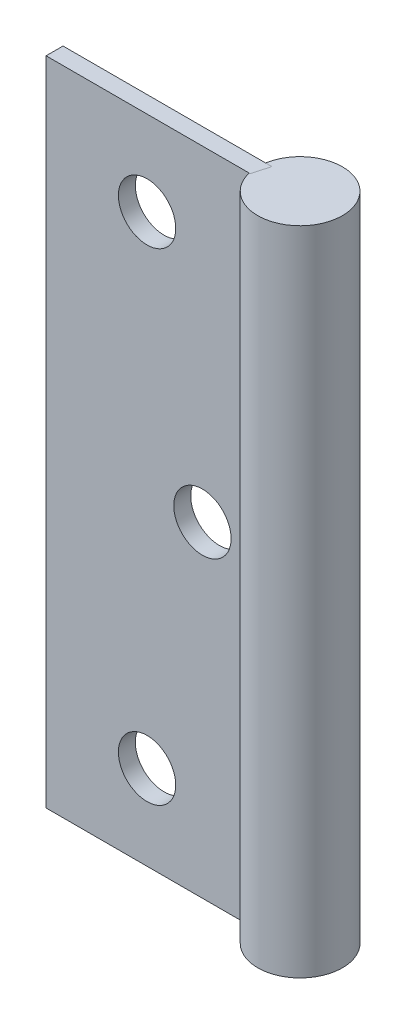
ISO-10303-21;
HEADER;
FILE_DESCRIPTION(('STEP AP214'),'2;1');
FILE_NAME('part.step','',(''),(''),'','','');
FILE_SCHEMA(('AUTOMOTIVE_DESIGN { 1 0 10303 214 1 1 1 1 }'));
ENDSEC;
DATA;
#1=APPLICATION_CONTEXT('core data for automotive mechanical design processes');
#2=APPLICATION_PROTOCOL_DEFINITION('international standard','automotive_design',2000,#1);
#3=PRODUCT_CONTEXT('',#1,'mechanical');
#4=PRODUCT('Part','Part','',(#3));
#5=PRODUCT_RELATED_PRODUCT_CATEGORY('part','',(#4));
#6=PRODUCT_DEFINITION_FORMATION('','',#4);
#7=PRODUCT_DEFINITION_CONTEXT('part definition',#1,'design');
#8=PRODUCT_DEFINITION('design','',#6,#7);
#9=PRODUCT_DEFINITION_SHAPE('','',#8);
#10=(LENGTH_UNIT() NAMED_UNIT(*) SI_UNIT(.MILLI.,.METRE.));
#11=(NAMED_UNIT(*) PLANE_ANGLE_UNIT() SI_UNIT($,.RADIAN.));
#12=(NAMED_UNIT(*) SI_UNIT($,.STERADIAN.) SOLID_ANGLE_UNIT());
#13=UNCERTAINTY_MEASURE_WITH_UNIT(LENGTH_MEASURE(1.E-05),#10,'distance_accuracy_value','');
#14=(GEOMETRIC_REPRESENTATION_CONTEXT(3) GLOBAL_UNCERTAINTY_ASSIGNED_CONTEXT((#13)) GLOBAL_UNIT_ASSIGNED_CONTEXT((#10,
#11,#12)) REPRESENTATION_CONTEXT('',''));
#15=CARTESIAN_POINT('',(0.,0.,0.));
#16=DIRECTION('',(0.,0.,1.));
#17=DIRECTION('',(1.,0.,0.));
#18=AXIS2_PLACEMENT_3D('',#15,#16,#17);
#19=CARTESIAN_POINT('',(10.75,34.1923881554251,0.553753860856567));
#20=DIRECTION('',(0.,-1.,0.));
#21=DIRECTION('',(0.,0.,-1.));
#22=AXIS2_PLACEMENT_3D('',#19,#20,#21);
#23=CYLINDRICAL_SURFACE('',#22,3.25);
#24=CARTESIAN_POINT('',(10.75,25.,0.553753860856567));
#25=DIRECTION('',(0.,-1.,0.));
#26=DIRECTION('',(1.,0.,0.));
#27=AXIS2_PLACEMENT_3D('',#24,#25,#26);
#28=CIRCLE('',#27,3.25);
#29=CARTESIAN_POINT('',(10.75,25.,-2.69624613914344));
#30=VERTEX_POINT('',#29);
#31=EDGE_CURVE('E11',#30,#30,#28,.F.);
#32=CARTESIAN_POINT('',(10.75,-25.,0.553753860856567));
#33=DIRECTION('',(0.,-1.,0.));
#34=DIRECTION('',(0.,0.,-1.));
#35=AXIS2_PLACEMENT_3D('',#32,#33,#34);
#36=CIRCLE('',#35,3.25);
#37=CARTESIAN_POINT('',(10.75,-25.,-2.69624613914344));
#38=VERTEX_POINT('',#37);
#39=EDGE_CURVE('E58',#38,#38,#36,.T.);
#40=CARTESIAN_POINT('',(10.75,25.,-2.69624613914344));
#41=CARTESIAN_POINT('',(10.75,24.4791666666667,-2.69624613914344));
#42=CARTESIAN_POINT('',(10.75,23.9583333333333,-2.69624613914344));
#43=CARTESIAN_POINT('',(10.75,22.9166666666667,-2.69624613914344));
#44=CARTESIAN_POINT('',(10.75,22.3958333333333,-2.69624613914344));
#45=CARTESIAN_POINT('',(10.75,21.3541666666667,-2.69624613914344));
#46=CARTESIAN_POINT('',(10.75,20.8333333333333,-2.69624613914344));
#47=CARTESIAN_POINT('',(10.75,19.7916666666667,-2.69624613914344));
#48=CARTESIAN_POINT('',(10.75,19.2708333333333,-2.69624613914344));
#49=CARTESIAN_POINT('',(10.75,18.2291666666667,-2.69624613914344));
#50=CARTESIAN_POINT('',(10.75,17.7083333333333,-2.69624613914344));
#51=CARTESIAN_POINT('',(10.75,16.6666666666667,-2.69624613914344));
#52=CARTESIAN_POINT('',(10.75,16.1458333333333,-2.69624613914344));
#53=CARTESIAN_POINT('',(10.75,15.1041666666667,-2.69624613914344));
#54=CARTESIAN_POINT('',(10.75,14.5833333333333,-2.69624613914344));
#55=CARTESIAN_POINT('',(10.75,13.5416666666667,-2.69624613914344));
#56=CARTESIAN_POINT('',(10.75,13.0208333333333,-2.69624613914344));
#57=CARTESIAN_POINT('',(10.75,11.9791666666667,-2.69624613914344));
#58=CARTESIAN_POINT('',(10.75,11.4583333333333,-2.69624613914344));
#59=CARTESIAN_POINT('',(10.75,10.4166666666667,-2.69624613914344));
#60=CARTESIAN_POINT('',(10.75,9.89583333333334,-2.69624613914344));
#61=CARTESIAN_POINT('',(10.75,8.85416666666667,-2.69624613914344));
#62=CARTESIAN_POINT('',(10.75,8.33333333333334,-2.69624613914344));
#63=CARTESIAN_POINT('',(10.75,7.29166666666667,-2.69624613914344));
#64=CARTESIAN_POINT('',(10.75,6.77083333333334,-2.69624613914344));
#65=CARTESIAN_POINT('',(10.75,5.72916666666667,-2.69624613914344));
#66=CARTESIAN_POINT('',(10.75,5.20833333333334,-2.69624613914344));
#67=CARTESIAN_POINT('',(10.75,4.16666666666667,-2.69624613914344));
#68=CARTESIAN_POINT('',(10.75,3.64583333333334,-2.69624613914344));
#69=CARTESIAN_POINT('',(10.75,2.60416666666667,-2.69624613914344));
#70=CARTESIAN_POINT('',(10.75,2.08333333333334,-2.69624613914344));
#71=CARTESIAN_POINT('',(10.75,1.04166666666667,-2.69624613914344));
#72=CARTESIAN_POINT('',(10.75,0.520833333333341,-2.69624613914344));
#73=CARTESIAN_POINT('',(10.75,-0.520833333333327,-2.69624613914344));
#74=CARTESIAN_POINT('',(10.75,-1.04166666666666,-2.69624613914344));
#75=CARTESIAN_POINT('',(10.75,-2.08333333333333,-2.69624613914344));
#76=CARTESIAN_POINT('',(10.75,-2.60416666666666,-2.69624613914344));
#77=CARTESIAN_POINT('',(10.75,-3.64583333333332,-2.69624613914344));
#78=CARTESIAN_POINT('',(10.75,-4.16666666666666,-2.69624613914344));
#79=CARTESIAN_POINT('',(10.75,-5.20833333333333,-2.69624613914344));
#80=CARTESIAN_POINT('',(10.75,-5.72916666666666,-2.69624613914344));
#81=CARTESIAN_POINT('',(10.75,-6.77083333333333,-2.69624613914344));
#82=CARTESIAN_POINT('',(10.75,-7.29166666666666,-2.69624613914344));
#83=CARTESIAN_POINT('',(10.75,-8.33333333333333,-2.69624613914344));
#84=CARTESIAN_POINT('',(10.75,-8.85416666666666,-2.69624613914344));
#85=CARTESIAN_POINT('',(10.75,-9.89583333333333,-2.69624613914344));
#86=CARTESIAN_POINT('',(10.75,-10.4166666666667,-2.69624613914344));
#87=CARTESIAN_POINT('',(10.75,-11.4583333333333,-2.69624613914344));
#88=CARTESIAN_POINT('',(10.75,-11.9791666666667,-2.69624613914344));
#89=CARTESIAN_POINT('',(10.75,-13.0208333333333,-2.69624613914344));
#90=CARTESIAN_POINT('',(10.75,-13.5416666666667,-2.69624613914344));
#91=CARTESIAN_POINT('',(10.75,-14.5833333333333,-2.69624613914344));
#92=CARTESIAN_POINT('',(10.75,-15.1041666666667,-2.69624613914344));
#93=CARTESIAN_POINT('',(10.75,-16.1458333333333,-2.69624613914344));
#94=CARTESIAN_POINT('',(10.75,-16.6666666666667,-2.69624613914344));
#95=CARTESIAN_POINT('',(10.75,-17.7083333333333,-2.69624613914344));
#96=CARTESIAN_POINT('',(10.75,-18.2291666666667,-2.69624613914344));
#97=CARTESIAN_POINT('',(10.75,-19.2708333333333,-2.69624613914344));
#98=CARTESIAN_POINT('',(10.75,-19.7916666666667,-2.69624613914344));
#99=CARTESIAN_POINT('',(10.75,-20.8333333333333,-2.69624613914344));
#100=CARTESIAN_POINT('',(10.75,-21.3541666666667,-2.69624613914344));
#101=CARTESIAN_POINT('',(10.75,-22.3958333333333,-2.69624613914344));
#102=CARTESIAN_POINT('',(10.75,-22.9166666666667,-2.69624613914344));
#103=CARTESIAN_POINT('',(10.75,-23.9583333333333,-2.69624613914344));
#104=CARTESIAN_POINT('',(10.75,-24.4791666666667,-2.69624613914344));
#105=CARTESIAN_POINT('',(10.75,-25.,-2.69624613914344));
#106=B_SPLINE_CURVE_WITH_KNOTS('',3,(#40,#41,#42,#43,#44,#45,#46,#47,#48,#49,#50,#51,#52,#53,
#54,#55,#56,#57,#58,#59,#60,#61,#62,#63,#64,#65,#66,#67,#68,#69,#70,#71,#72,#73,#74,#75,#76,#77,
#78,#79,#80,#81,#82,#83,#84,#85,#86,#87,#88,#89,#90,#91,#92,#93,#94,#95,#96,#97,#98,#99,#100,
#101,#102,#103,#104,#105),.UNSPECIFIED.,.F.,.F.,(4,2,2,2,2,2,2,2,2,2,2,2,2,2,2,2,2,2,2,2,2,2,2,
2,2,2,2,2,2,2,2,2,4),(0.,1.5625,3.125,4.6875,6.25,7.8125,9.375,10.9375,12.5,14.0625,15.625,
17.1875,18.75,20.3125,21.875,23.4375,25.,26.5625,28.125,29.6875,31.25,32.8125,34.375,35.9375,
37.5,39.0625,40.625,42.1875,43.75,45.3125,46.875,48.4375,50.),.UNSPECIFIED.);
#107=EDGE_CURVE('BSEAM51',#30,#38,#106,.T.);
#108=ORIENTED_EDGE('',*,*,#31,.F.);
#109=ORIENTED_EDGE('',*,*,#39,.F.);
#110=ORIENTED_EDGE('',*,*,#107,.T.);
#111=ORIENTED_EDGE('',*,*,#107,.F.);
#112=EDGE_LOOP('',(#108,#110,#109,#111));
#113=FACE_BOUND('',#112,.T.);
#114=ADVANCED_FACE('F51',(#113),#23,.T.);
#115=CARTESIAN_POINT('',(10.75,-25.,0.553753860856567));
#116=DIRECTION('',(0.,-1.,0.));
#117=DIRECTION('',(0.,0.,-1.));
#118=AXIS2_PLACEMENT_3D('',#115,#116,#117);
#119=PLANE('',#118);
#120=ORIENTED_EDGE('',*,*,#39,.T.);
#121=EDGE_LOOP('',(#120));
#122=FACE_BOUND('',#121,.T.);
#123=ADVANCED_FACE('F65',(#122),#119,.T.);
#124=CARTESIAN_POINT('',(8.,25.,1.3));
#125=DIRECTION('',(0.,-1.,0.));
#126=DIRECTION('',(1.,0.,0.));
#127=AXIS2_PLACEMENT_3D('',#124,#125,#126);
#128=PLANE('',#127);
#129=ORIENTED_EDGE('',*,*,#31,.T.);
#130=EDGE_LOOP('',(#129));
#131=FACE_BOUND('',#130,.T.);
#132=ADVANCED_FACE('F72',(#131),#128,.F.);
#133=CLOSED_SHELL('',(#114,#123,#132));
#134=MANIFOLD_SOLID_BREP('B2',#133);
#135=CARTESIAN_POINT('',(-8.,-25.,1.3));
#136=DIRECTION('',(1.,0.,0.));
#137=DIRECTION('',(0.,0.,-1.));
#138=AXIS2_PLACEMENT_3D('',#135,#136,#137);
#139=PLANE('',#138);
#140=DIRECTION('',(0.,-1.,0.));
#141=VECTOR('',#140,1.);
#142=CARTESIAN_POINT('',(-8.,-25.,0.));
#143=LINE('',#142,#141);
#144=CARTESIAN_POINT('',(-8.,25.,0.));
#145=VERTEX_POINT('',#144);
#146=CARTESIAN_POINT('',(-8.,-25.,0.));
#147=VERTEX_POINT('',#146);
#148=EDGE_CURVE('E165',#145,#147,#143,.T.);
#149=ORIENTED_EDGE('',*,*,#148,.T.);
#150=DIRECTION('',(0.,0.,-1.));
#151=VECTOR('',#150,1.);
#152=CARTESIAN_POINT('',(-8.,-25.,1.3));
#153=LINE('',#152,#151);
#154=CARTESIAN_POINT('',(-8.,-25.,1.3));
#155=VERTEX_POINT('',#154);
#156=EDGE_CURVE('E49',#155,#147,#153,.T.);
#157=ORIENTED_EDGE('',*,*,#156,.F.);
#158=DIRECTION('',(0.,-1.,0.));
#159=VECTOR('',#158,1.);
#160=CARTESIAN_POINT('',(-8.,-25.,1.3));
#161=LINE('',#160,#159);
#162=CARTESIAN_POINT('',(-8.,25.,1.3));
#163=VERTEX_POINT('',#162);
#164=EDGE_CURVE('E152',#163,#155,#161,.T.);
#165=ORIENTED_EDGE('',*,*,#164,.F.);
#166=DIRECTION('',(0.,0.,-1.));
#167=VECTOR('',#166,1.);
#168=CARTESIAN_POINT('',(-8.,25.,1.3));
#169=LINE('',#168,#167);
#170=EDGE_CURVE('E161',#163,#145,#169,.T.);
#171=ORIENTED_EDGE('',*,*,#170,.T.);
#172=EDGE_LOOP('',(#149,#157,#165,#171));
#173=FACE_BOUND('',#172,.T.);
#174=ADVANCED_FACE('F99',(#173),#139,.F.);
#175=CARTESIAN_POINT('',(8.,-25.,1.3));
#176=DIRECTION('',(0.,1.,0.));
#177=DIRECTION('',(0.,0.,1.));
#178=AXIS2_PLACEMENT_3D('',#175,#176,#177);
#179=PLANE('',#178);
#180=DIRECTION('',(1.,0.,0.));
#181=VECTOR('',#180,1.);
#182=CARTESIAN_POINT('',(8.,-25.,0.));
#183=LINE('',#182,#181);
#184=CARTESIAN_POINT('',(8.,-25.,0.));
#185=VERTEX_POINT('',#184);
#186=EDGE_CURVE('E156',#147,#185,#183,.T.);
#187=ORIENTED_EDGE('',*,*,#186,.T.);
#188=DIRECTION('',(0.,0.,-1.));
#189=VECTOR('',#188,1.);
#190=CARTESIAN_POINT('',(8.,-25.,1.3));
#191=LINE('',#190,#189);
#192=CARTESIAN_POINT('',(8.,-25.,1.3));
#193=VERTEX_POINT('',#192);
#194=EDGE_CURVE('E108',#193,#185,#191,.T.);
#195=ORIENTED_EDGE('',*,*,#194,.F.);
#196=DIRECTION('',(1.,0.,0.));
#197=VECTOR('',#196,1.);
#198=CARTESIAN_POINT('',(8.,-25.,1.3));
#199=LINE('',#198,#197);
#200=EDGE_CURVE('E147',#155,#193,#199,.T.);
#201=ORIENTED_EDGE('',*,*,#200,.F.);
#202=ORIENTED_EDGE('',*,*,#156,.T.);
#203=EDGE_LOOP('',(#187,#195,#201,#202));
#204=FACE_BOUND('',#203,.T.);
#205=ADVANCED_FACE('F155',(#204),#179,.F.);
#206=CARTESIAN_POINT('',(8.,-25.,1.3));
#207=DIRECTION('',(-1.,0.,0.));
#208=DIRECTION('',(0.,0.,1.));
#209=AXIS2_PLACEMENT_3D('',#206,#207,#208);
#210=PLANE('',#209);
#211=DIRECTION('',(0.,1.,0.));
#212=VECTOR('',#211,1.);
#213=CARTESIAN_POINT('',(8.,-25.,0.));
#214=LINE('',#213,#212);
#215=CARTESIAN_POINT('',(8.,25.,0.));
#216=VERTEX_POINT('',#215);
#217=EDGE_CURVE('E134',#185,#216,#214,.T.);
#218=ORIENTED_EDGE('',*,*,#217,.T.);
#219=DIRECTION('',(0.,0.,-1.));
#220=VECTOR('',#219,1.);
#221=CARTESIAN_POINT('',(8.,25.,1.3));
#222=LINE('',#221,#220);
#223=CARTESIAN_POINT('',(8.,25.,1.3));
#224=VERTEX_POINT('',#223);
#225=EDGE_CURVE('E157',#224,#216,#222,.T.);
#226=ORIENTED_EDGE('',*,*,#225,.F.);
#227=DIRECTION('',(0.,1.,0.));
#228=VECTOR('',#227,1.);
#229=CARTESIAN_POINT('',(8.,-25.,1.3));
#230=LINE('',#229,#228);
#231=EDGE_CURVE('E150',#193,#224,#230,.T.);
#232=ORIENTED_EDGE('',*,*,#231,.F.);
#233=ORIENTED_EDGE('',*,*,#194,.T.);
#234=EDGE_LOOP('',(#218,#226,#232,#233));
#235=FACE_BOUND('',#234,.T.);
#236=ADVANCED_FACE('F159',(#235),#210,.F.);
#237=CARTESIAN_POINT('',(8.,25.,1.3));
#238=DIRECTION('',(0.,-1.,0.));
#239=DIRECTION('',(1.,0.,0.));
#240=AXIS2_PLACEMENT_3D('',#237,#238,#239);
#241=PLANE('',#240);
#242=DIRECTION('',(-1.,0.,0.));
#243=VECTOR('',#242,1.);
#244=CARTESIAN_POINT('',(8.,25.,0.));
#245=LINE('',#244,#243);
#246=EDGE_CURVE('E140',#216,#145,#245,.T.);
#247=ORIENTED_EDGE('',*,*,#246,.T.);
#248=ORIENTED_EDGE('',*,*,#170,.F.);
#249=DIRECTION('',(-1.,0.,0.));
#250=VECTOR('',#249,1.);
#251=CARTESIAN_POINT('',(8.,25.,1.3));
#252=LINE('',#251,#250);
#253=EDGE_CURVE('E117',#224,#163,#252,.T.);
#254=ORIENTED_EDGE('',*,*,#253,.F.);
#255=ORIENTED_EDGE('',*,*,#225,.T.);
#256=EDGE_LOOP('',(#247,#248,#254,#255));
#257=FACE_BOUND('',#256,.T.);
#258=ADVANCED_FACE('F212',(#257),#241,.F.);
#259=CARTESIAN_POINT('',(0.,0.,1.3));
#260=DIRECTION('',(0.,0.,1.));
#261=DIRECTION('',(1.,0.,0.));
#262=AXIS2_PLACEMENT_3D('',#259,#260,#261);
#263=PLANE('',#262);
#264=CARTESIAN_POINT('',(-0.249999999999999,-18.5,1.3));
#265=DIRECTION('',(0.,0.,1.));
#266=DIRECTION('',(-1.,0.,0.));
#267=AXIS2_PLACEMENT_3D('',#264,#265,#266);
#268=CIRCLE('',#267,2.2);
#269=CARTESIAN_POINT('',(-2.45,-18.5,1.3));
#270=VERTEX_POINT('',#269);
#271=EDGE_CURVE('E287',#270,#270,#268,.T.);
#272=ORIENTED_EDGE('',*,*,#271,.F.);
#273=EDGE_LOOP('',(#272));
#274=FACE_BOUND('',#273,.T.);
#275=CARTESIAN_POINT('',(-0.249999999999999,18.5,1.3));
#276=DIRECTION('',(0.,0.,1.));
#277=DIRECTION('',(1.,0.,0.));
#278=AXIS2_PLACEMENT_3D('',#275,#276,#277);
#279=CIRCLE('',#278,2.2);
#280=CARTESIAN_POINT('',(1.95,18.5,1.3));
#281=VERTEX_POINT('',#280);
#282=EDGE_CURVE('E291',#281,#281,#279,.T.);
#283=ORIENTED_EDGE('',*,*,#282,.F.);
#284=EDGE_LOOP('',(#283));
#285=FACE_BOUND('',#284,.T.);
#286=CARTESIAN_POINT('',(4.,0.,1.3));
#287=DIRECTION('',(0.,0.,1.));
#288=DIRECTION('',(1.,0.,0.));
#289=AXIS2_PLACEMENT_3D('',#286,#287,#288);
#290=CIRCLE('',#289,2.2);
#291=CARTESIAN_POINT('',(6.2,0.,1.3));
#292=VERTEX_POINT('',#291);
#293=EDGE_CURVE('E176',#292,#292,#290,.T.);
#294=ORIENTED_EDGE('',*,*,#293,.F.);
#295=EDGE_LOOP('',(#294));
#296=FACE_BOUND('',#295,.T.);
#297=ORIENTED_EDGE('',*,*,#164,.T.);
#298=ORIENTED_EDGE('',*,*,#200,.T.);
#299=ORIENTED_EDGE('',*,*,#231,.T.);
#300=ORIENTED_EDGE('',*,*,#253,.T.);
#301=EDGE_LOOP('',(#297,#298,#299,#300));
#302=FACE_BOUND('',#301,.T.);
#303=ADVANCED_FACE('F148',(#274,#285,#296,#302),#263,.T.);
#304=CARTESIAN_POINT('',(0.,0.,0.));
#305=DIRECTION('',(0.,0.,1.));
#306=DIRECTION('',(1.,0.,0.));
#307=AXIS2_PLACEMENT_3D('',#304,#305,#306);
#308=PLANE('',#307);
#309=CARTESIAN_POINT('',(-0.249999999999999,-18.5,0.));
#310=DIRECTION('',(0.,0.,1.));
#311=DIRECTION('',(1.,0.,0.));
#312=AXIS2_PLACEMENT_3D('',#309,#310,#311);
#313=CIRCLE('',#312,2.2);
#314=CARTESIAN_POINT('',(1.95,-18.5,0.));
#315=VERTEX_POINT('',#314);
#316=EDGE_CURVE('E102',#315,#315,#313,.T.);
#317=ORIENTED_EDGE('',*,*,#316,.T.);
#318=EDGE_LOOP('',(#317));
#319=FACE_BOUND('',#318,.T.);
#320=CARTESIAN_POINT('',(-0.249999999999999,18.5,0.));
#321=DIRECTION('',(0.,0.,1.));
#322=DIRECTION('',(1.,0.,0.));
#323=AXIS2_PLACEMENT_3D('',#320,#321,#322);
#324=CIRCLE('',#323,2.2);
#325=CARTESIAN_POINT('',(1.95,18.5,0.));
#326=VERTEX_POINT('',#325);
#327=EDGE_CURVE('E175',#326,#326,#324,.T.);
#328=ORIENTED_EDGE('',*,*,#327,.T.);
#329=EDGE_LOOP('',(#328));
#330=FACE_BOUND('',#329,.T.);
#331=CARTESIAN_POINT('',(4.,0.,0.));
#332=DIRECTION('',(0.,0.,1.));
#333=DIRECTION('',(1.,0.,0.));
#334=AXIS2_PLACEMENT_3D('',#331,#332,#333);
#335=CIRCLE('',#334,2.2);
#336=CARTESIAN_POINT('',(6.2,0.,0.));
#337=VERTEX_POINT('',#336);
#338=EDGE_CURVE('E173',#337,#337,#335,.T.);
#339=ORIENTED_EDGE('',*,*,#338,.T.);
#340=EDGE_LOOP('',(#339));
#341=FACE_BOUND('',#340,.T.);
#342=ORIENTED_EDGE('',*,*,#148,.F.);
#343=ORIENTED_EDGE('',*,*,#246,.F.);
#344=ORIENTED_EDGE('',*,*,#217,.F.);
#345=ORIENTED_EDGE('',*,*,#186,.F.);
#346=EDGE_LOOP('',(#342,#343,#344,#345));
#347=FACE_BOUND('',#346,.T.);
#348=ADVANCED_FACE('F183',(#319,#330,#341,#347),#308,.F.);
#349=CARTESIAN_POINT('',(4.,0.,-0.7));
#350=DIRECTION('',(0.,0.,1.));
#351=DIRECTION('',(1.,0.,0.));
#352=AXIS2_PLACEMENT_3D('',#349,#350,#351);
#353=CYLINDRICAL_SURFACE('',#352,2.2);
#354=ORIENTED_EDGE('',*,*,#293,.T.);
#355=EDGE_LOOP('',(#354));
#356=FACE_BOUND('',#355,.T.);
#357=ORIENTED_EDGE('',*,*,#338,.F.);
#358=EDGE_LOOP('',(#357));
#359=FACE_BOUND('',#358,.T.);
#360=ADVANCED_FACE('F193',(#356,#359),#353,.F.);
#361=CARTESIAN_POINT('',(-0.249999999999999,18.5,-0.7));
#362=DIRECTION('',(0.,0.,1.));
#363=DIRECTION('',(1.,0.,0.));
#364=AXIS2_PLACEMENT_3D('',#361,#362,#363);
#365=CYLINDRICAL_SURFACE('',#364,2.2);
#366=ORIENTED_EDGE('',*,*,#282,.T.);
#367=EDGE_LOOP('',(#366));
#368=FACE_BOUND('',#367,.T.);
#369=ORIENTED_EDGE('',*,*,#327,.F.);
#370=EDGE_LOOP('',(#369));
#371=FACE_BOUND('',#370,.T.);
#372=ADVANCED_FACE('F187',(#368,#371),#365,.F.);
#373=CARTESIAN_POINT('',(-0.249999999999999,-18.5,-0.7));
#374=DIRECTION('',(0.,0.,1.));
#375=DIRECTION('',(1.,0.,0.));
#376=AXIS2_PLACEMENT_3D('',#373,#374,#375);
#377=CYLINDRICAL_SURFACE('',#376,2.2);
#378=ORIENTED_EDGE('',*,*,#271,.T.);
#379=EDGE_LOOP('',(#378));
#380=FACE_BOUND('',#379,.T.);
#381=ORIENTED_EDGE('',*,*,#316,.F.);
#382=EDGE_LOOP('',(#381));
#383=FACE_BOUND('',#382,.T.);
#384=ADVANCED_FACE('F185',(#380,#383),#377,.F.);
#385=CLOSED_SHELL('',(#174,#205,#236,#258,#303,#348,#360,#372,#384));
#386=MANIFOLD_SOLID_BREP('B6',#385);
#387=ADVANCED_BREP_SHAPE_REPRESENTATION('',(#18,#134,#386),#14);
#388=SHAPE_DEFINITION_REPRESENTATION(#9,#387);
ENDSEC;
END-ISO-10303-21;
